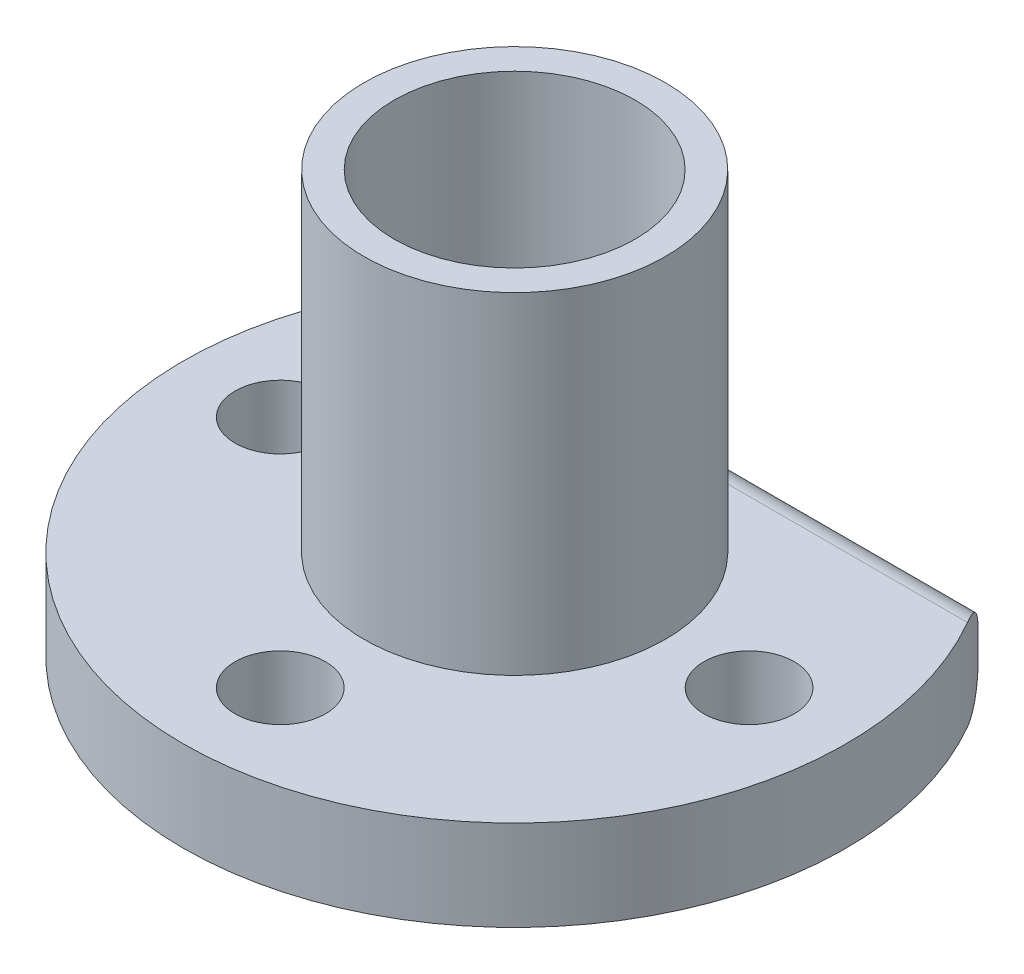
ISO-10303-21;
HEADER;
FILE_DESCRIPTION(('STEP AP214'),'2;1');
FILE_NAME('part.step','',(''),(''),'','','');
FILE_SCHEMA(('AUTOMOTIVE_DESIGN { 1 0 10303 214 1 1 1 1 }'));
ENDSEC;
DATA;
#1=APPLICATION_CONTEXT('core data for automotive mechanical design processes');
#2=APPLICATION_PROTOCOL_DEFINITION('international standard','automotive_design',2000,#1);
#3=PRODUCT_CONTEXT('',#1,'mechanical');
#4=PRODUCT('Part','Part','',(#3));
#5=PRODUCT_RELATED_PRODUCT_CATEGORY('part','',(#4));
#6=PRODUCT_DEFINITION_FORMATION('','',#4);
#7=PRODUCT_DEFINITION_CONTEXT('part definition',#1,'design');
#8=PRODUCT_DEFINITION('design','',#6,#7);
#9=PRODUCT_DEFINITION_SHAPE('','',#8);
#10=(LENGTH_UNIT() NAMED_UNIT(*) SI_UNIT(.MILLI.,.METRE.));
#11=(NAMED_UNIT(*) PLANE_ANGLE_UNIT() SI_UNIT($,.RADIAN.));
#12=(NAMED_UNIT(*) SI_UNIT($,.STERADIAN.) SOLID_ANGLE_UNIT());
#13=UNCERTAINTY_MEASURE_WITH_UNIT(LENGTH_MEASURE(1.E-05),#10,'distance_accuracy_value','');
#14=(GEOMETRIC_REPRESENTATION_CONTEXT(3) GLOBAL_UNCERTAINTY_ASSIGNED_CONTEXT((#13)) GLOBAL_UNIT_ASSIGNED_CONTEXT((#10,
#11,#12)) REPRESENTATION_CONTEXT('',''));
#15=CARTESIAN_POINT('',(0.,0.,0.));
#16=DIRECTION('',(0.,0.,1.));
#17=DIRECTION('',(1.,0.,0.));
#18=AXIS2_PLACEMENT_3D('',#15,#16,#17);
#19=CARTESIAN_POINT('',(5.,0.,0.));
#20=DIRECTION('',(0.,-1.,0.));
#21=DIRECTION('',(0.,0.,-1.));
#22=AXIS2_PLACEMENT_3D('',#19,#20,#21);
#23=PLANE('',#22);
#24=CARTESIAN_POINT('',(0.,0.,0.));
#25=DIRECTION('',(0.,-1.,0.));
#26=DIRECTION('',(0.,0.,-1.));
#27=AXIS2_PLACEMENT_3D('',#24,#25,#26);
#28=CIRCLE('',#27,5.);
#29=CARTESIAN_POINT('',(0.,0.,-5.));
#30=VERTEX_POINT('',#29);
#31=EDGE_CURVE('E137',#30,#30,#28,.T.);
#32=ORIENTED_EDGE('',*,*,#31,.T.);
#33=EDGE_LOOP('',(#32));
#34=FACE_BOUND('',#33,.T.);
#35=CARTESIAN_POINT('',(0.,0.,0.));
#36=DIRECTION('',(0.,-1.,0.));
#37=DIRECTION('',(0.,0.,-1.));
#38=AXIS2_PLACEMENT_3D('',#35,#36,#37);
#39=CIRCLE('',#38,4.);
#40=CARTESIAN_POINT('',(0.,0.,-4.));
#41=VERTEX_POINT('',#40);
#42=EDGE_CURVE('E156',#41,#41,#39,.T.);
#43=ORIENTED_EDGE('',*,*,#42,.F.);
#44=EDGE_LOOP('',(#43));
#45=FACE_BOUND('',#44,.T.);
#46=ADVANCED_FACE('F33',(#34,#45),#23,.T.);
#47=CARTESIAN_POINT('',(0.,0.,0.));
#48=DIRECTION('',(0.,-1.,0.));
#49=DIRECTION('',(0.,0.,-1.));
#50=AXIS2_PLACEMENT_3D('',#47,#48,#49);
#51=CYLINDRICAL_SURFACE('',#50,4.);
#52=ORIENTED_EDGE('',*,*,#42,.T.);
#53=EDGE_LOOP('',(#52));
#54=FACE_BOUND('',#53,.T.);
#55=CARTESIAN_POINT('',(0.,15.,0.));
#56=DIRECTION('',(0.,-1.,0.));
#57=DIRECTION('',(0.,0.,-1.));
#58=AXIS2_PLACEMENT_3D('',#55,#56,#57);
#59=CIRCLE('',#58,4.);
#60=CARTESIAN_POINT('',(0.,15.,-4.));
#61=VERTEX_POINT('',#60);
#62=EDGE_CURVE('E153',#61,#61,#59,.T.);
#63=ORIENTED_EDGE('',*,*,#62,.F.);
#64=EDGE_LOOP('',(#63));
#65=FACE_BOUND('',#64,.T.);
#66=ADVANCED_FACE('F234',(#54,#65),#51,.F.);
#67=CARTESIAN_POINT('',(4.,15.,0.));
#68=DIRECTION('',(0.,1.,0.));
#69=DIRECTION('',(0.,0.,1.));
#70=AXIS2_PLACEMENT_3D('',#67,#68,#69);
#71=PLANE('',#70);
#72=ORIENTED_EDGE('',*,*,#62,.T.);
#73=EDGE_LOOP('',(#72));
#74=FACE_BOUND('',#73,.T.);
#75=CARTESIAN_POINT('',(0.,15.,0.));
#76=DIRECTION('',(0.,-1.,0.));
#77=DIRECTION('',(0.,0.,-1.));
#78=AXIS2_PLACEMENT_3D('',#75,#76,#77);
#79=CIRCLE('',#78,5.);
#80=CARTESIAN_POINT('',(0.,15.,-5.));
#81=VERTEX_POINT('',#80);
#82=EDGE_CURVE('E150',#81,#81,#79,.T.);
#83=ORIENTED_EDGE('',*,*,#82,.F.);
#84=EDGE_LOOP('',(#83));
#85=FACE_BOUND('',#84,.T.);
#86=ADVANCED_FACE('F239',(#74,#85),#71,.T.);
#87=CARTESIAN_POINT('',(0.,0.,0.));
#88=DIRECTION('',(0.,-1.,0.));
#89=DIRECTION('',(0.,0.,-1.));
#90=AXIS2_PLACEMENT_3D('',#87,#88,#89);
#91=CYLINDRICAL_SURFACE('',#90,5.);
#92=ORIENTED_EDGE('',*,*,#82,.T.);
#93=EDGE_LOOP('',(#92));
#94=FACE_BOUND('',#93,.T.);
#95=CARTESIAN_POINT('',(0.,4.,0.));
#96=DIRECTION('',(0.,-1.,0.));
#97=DIRECTION('',(0.,0.,-1.));
#98=AXIS2_PLACEMENT_3D('',#95,#96,#97);
#99=CIRCLE('',#98,5.);
#100=CARTESIAN_POINT('',(0.,4.,-5.));
#101=VERTEX_POINT('',#100);
#102=EDGE_CURVE('E147',#101,#101,#99,.T.);
#103=ORIENTED_EDGE('',*,*,#102,.F.);
#104=EDGE_LOOP('',(#103));
#105=FACE_BOUND('',#104,.T.);
#106=ADVANCED_FACE('F249',(#94,#105),#91,.T.);
#107=CARTESIAN_POINT('',(5.,4.,0.));
#108=DIRECTION('',(0.,1.,0.));
#109=DIRECTION('',(0.,0.,1.));
#110=AXIS2_PLACEMENT_3D('',#107,#108,#109);
#111=PLANE('',#110);
#112=CARTESIAN_POINT('',(0.,4.,0.));
#113=DIRECTION('',(0.,-1.,0.));
#114=DIRECTION('',(0.,0.,-1.));
#115=AXIS2_PLACEMENT_3D('',#112,#113,#114);
#116=CIRCLE('',#115,11.);
#117=CARTESIAN_POINT('',(9.52627944162882,4.,-5.5));
#118=VERTEX_POINT('',#117);
#119=CARTESIAN_POINT('',(-9.52627944162882,4.,-5.5));
#120=VERTEX_POINT('',#119);
#121=EDGE_CURVE('E145',#118,#120,#116,.T.);
#122=ORIENTED_EDGE('',*,*,#121,.F.);
#123=DIRECTION('',(1.,0.,0.));
#124=VECTOR('',#123,1.);
#125=CARTESIAN_POINT('',(-8.87411967464942,4.,-5.5));
#126=LINE('',#125,#124);
#127=EDGE_CURVE('E11',#118,#120,#126,.F.);
#128=ORIENTED_EDGE('',*,*,#127,.T.);
#129=EDGE_LOOP('',(#122,#128));
#130=FACE_BOUND('',#129,.T.);
#131=CARTESIAN_POINT('',(-7.77817459305202,4.,0.));
#132=DIRECTION('',(0.,1.,0.));
#133=DIRECTION('',(0.,0.,1.));
#134=AXIS2_PLACEMENT_3D('',#131,#132,#133);
#135=CIRCLE('',#134,1.5);
#136=CARTESIAN_POINT('',(-7.77817459305202,4.,-1.5));
#137=VERTEX_POINT('',#136);
#138=EDGE_CURVE('E128',#137,#137,#135,.T.);
#139=ORIENTED_EDGE('',*,*,#138,.F.);
#140=EDGE_LOOP('',(#139));
#141=FACE_BOUND('',#140,.T.);
#142=CARTESIAN_POINT('',(0.,4.,7.77817459305202));
#143=DIRECTION('',(0.,1.,0.));
#144=DIRECTION('',(0.,0.,1.));
#145=AXIS2_PLACEMENT_3D('',#142,#143,#144);
#146=CIRCLE('',#145,1.5);
#147=CARTESIAN_POINT('',(0.,4.,6.27817459305202));
#148=VERTEX_POINT('',#147);
#149=EDGE_CURVE('E123',#148,#148,#146,.T.);
#150=ORIENTED_EDGE('',*,*,#149,.F.);
#151=EDGE_LOOP('',(#150));
#152=FACE_BOUND('',#151,.T.);
#153=CARTESIAN_POINT('',(7.77817459305202,4.,0.));
#154=DIRECTION('',(0.,1.,0.));
#155=DIRECTION('',(0.,0.,1.));
#156=AXIS2_PLACEMENT_3D('',#153,#154,#155);
#157=CIRCLE('',#156,1.5);
#158=CARTESIAN_POINT('',(7.77817459305202,4.,-1.5));
#159=VERTEX_POINT('',#158);
#160=EDGE_CURVE('E134',#159,#159,#157,.T.);
#161=ORIENTED_EDGE('',*,*,#160,.F.);
#162=EDGE_LOOP('',(#161));
#163=FACE_BOUND('',#162,.T.);
#164=ORIENTED_EDGE('',*,*,#102,.T.);
#165=EDGE_LOOP('',(#164));
#166=FACE_BOUND('',#165,.T.);
#167=ADVANCED_FACE('F178',(#130,#141,#152,#163,#166),#111,.T.);
#168=CARTESIAN_POINT('',(0.,0.,0.));
#169=DIRECTION('',(0.,-1.,0.));
#170=DIRECTION('',(0.,0.,-1.));
#171=AXIS2_PLACEMENT_3D('',#168,#169,#170);
#172=CYLINDRICAL_SURFACE('',#171,11.);
#173=DIRECTION('',(0.,1.,0.));
#174=VECTOR('',#173,1.);
#175=CARTESIAN_POINT('',(-8.87411967464942,0.,-6.5));
#176=LINE('',#175,#174);
#177=CARTESIAN_POINT('',(-8.87411967464942,2.,-6.5));
#178=VERTEX_POINT('',#177);
#179=CARTESIAN_POINT('',(-8.87411967464942,3.,-6.5));
#180=VERTEX_POINT('',#179);
#181=EDGE_CURVE('E105',#178,#180,#176,.T.);
#182=ORIENTED_EDGE('',*,*,#181,.F.);
#183=CARTESIAN_POINT('',(-8.87411967464942,2.,-6.5));
#184=CARTESIAN_POINT('',(-8.87411733521859,1.97552243158006,-6.50000224266943));
#185=CARTESIAN_POINT('',(-8.87477854433625,1.95105865034541,-6.49910056311208));
#186=CARTESIAN_POINT('',(-8.8774001363763,1.90234471577609,-6.49551955800258));
#187=CARTESIAN_POINT('',(-8.87935981091365,1.87809445326058,-6.4928412017254));
#188=CARTESIAN_POINT('',(-8.88710945439656,1.80623955474375,-6.48223460807233));
#189=CARTESIAN_POINT('',(-8.8947709059744,1.75918344863951,-6.47173387510639));
#190=CARTESIAN_POINT('',(-8.91452389554418,1.66805184040037,-6.44449694865473));
#191=CARTESIAN_POINT('',(-8.92660740642685,1.62397110790175,-6.42777205260846));
#192=CARTESIAN_POINT('',(-8.95448676592331,1.53949479339217,-6.38887615509148));
#193=CARTESIAN_POINT('',(-8.97028793725721,1.49910461148745,-6.36669734295916));
#194=CARTESIAN_POINT('',(-9.00618568588709,1.41963334334644,-6.31582610745991));
#195=CARTESIAN_POINT('',(-9.02652154580642,1.38090166515607,-6.28675993204139));
#196=CARTESIAN_POINT('',(-9.06974282390675,1.30880541186457,-6.22424385930395));
#197=CARTESIAN_POINT('',(-9.09262886991434,1.27544216337214,-6.19079288213803));
#198=CARTESIAN_POINT('',(-9.14463537393784,1.20857895021427,-6.11376936828728));
#199=CARTESIAN_POINT('',(-9.17412476464895,1.17620185861564,-6.06947037548908));
#200=CARTESIAN_POINT('',(-9.23465815806106,1.11940270588087,-5.97696940333824));
#201=CARTESIAN_POINT('',(-9.26570385288908,1.09498953003808,-5.92876313899113));
#202=CARTESIAN_POINT('',(-9.33510711845153,1.05002386840362,-5.81900105702275));
#203=CARTESIAN_POINT('',(-9.37363040565232,1.03136038011265,-5.75676852722461));
#204=CARTESIAN_POINT('',(-9.4504359019863,1.00635907339172,-5.62982566413355));
#205=CARTESIAN_POINT('',(-9.48871832113079,1.00000838329907,-5.56511799059213));
#206=CARTESIAN_POINT('',(-9.52627944162882,1.,-5.5));
#207=B_SPLINE_CURVE_WITH_KNOTS('',3,(#183,#184,#185,#186,#187,#188,#189,#190,#191,#192,#193,
#194,#195,#196,#197,#198,#199,#200,#201,#202,#203,#204,#205,#206),.UNSPECIFIED.,.F.,.F.,(4,2,2,
2,2,2,2,2,2,2,2,4),(0.,0.0733807615098602,0.146721522662486,0.292376076287692,0.4377675325565,
0.583368431994158,0.740356106608181,0.897382515535377,1.08353983997591,1.26990415428719,
1.49542651310196,1.72071298595469),.UNSPECIFIED.);
#208=CARTESIAN_POINT('',(-9.52627944162882,1.,-5.5));
#209=VERTEX_POINT('',#208);
#210=EDGE_CURVE('E87',#178,#209,#207,.T.);
#211=ORIENTED_EDGE('',*,*,#210,.T.);
#212=CARTESIAN_POINT('',(0.,1.,0.));
#213=DIRECTION('',(0.,-1.,0.));
#214=DIRECTION('',(0.,0.,-1.));
#215=AXIS2_PLACEMENT_3D('',#212,#213,#214);
#216=CIRCLE('',#215,11.);
#217=CARTESIAN_POINT('',(9.52627944162882,1.,-5.5));
#218=VERTEX_POINT('',#217);
#219=EDGE_CURVE('E143',#218,#209,#216,.T.);
#220=ORIENTED_EDGE('',*,*,#219,.F.);
#221=CARTESIAN_POINT('',(9.52627944162882,1.,-5.5));
#222=CARTESIAN_POINT('',(9.50497762594167,1.00000645750292,-5.53689883173628));
#223=CARTESIAN_POINT('',(9.48347545818617,1.00204311444901,-5.57364268361715));
#224=CARTESIAN_POINT('',(9.44024072133037,1.01011623979461,-5.64656078851044));
#225=CARTESIAN_POINT('',(9.41850811011904,1.01615345209341,-5.68273493430558));
#226=CARTESIAN_POINT('',(9.35307058170986,1.04023332946574,-5.7902582056198));
#227=CARTESIAN_POINT('',(9.30928682310176,1.06424338955272,-5.86033003735499));
#228=CARTESIAN_POINT('',(9.22846820970288,1.12395148276247,-5.98668277091864));
#229=CARTESIAN_POINT('',(9.19123325075071,1.15800368881251,-6.04362501119194));
#230=CARTESIAN_POINT('',(9.11988980612419,1.23779265726256,-6.15074961575707));
#231=CARTESIAN_POINT('',(9.08577224402027,1.2834939279424,-6.20095181822179));
#232=CARTESIAN_POINT('',(9.03091608643213,1.37273648685774,-6.28046641498379));
#233=CARTESIAN_POINT('',(9.00900513097411,1.4137508357753,-6.31181670074728));
#234=CARTESIAN_POINT('',(8.96904408289645,1.50152497015127,-6.36847298356024));
#235=CARTESIAN_POINT('',(8.95099404474053,1.54828483664369,-6.39377889534583));
#236=CARTESIAN_POINT('',(8.91979073577717,1.64712255934501,-6.43724021851489));
#237=CARTESIAN_POINT('',(8.90668353200379,1.69924494710103,-6.45532844768));
#238=CARTESIAN_POINT('',(8.8867652353124,1.80683617075153,-6.48272321791942));
#239=CARTESIAN_POINT('',(8.8799350224314,1.86229429226268,-6.4920564289382));
#240=CARTESIAN_POINT('',(8.87575398968204,1.93182673472634,-6.49776811979553));
#241=CARTESIAN_POINT('',(8.87514130393432,1.94544896623536,-6.49860496031371));
#242=CARTESIAN_POINT('',(8.87432488733497,1.97271192583679,-6.49971992916767));
#243=CARTESIAN_POINT('',(8.87412066015987,1.98635261130234,-6.49999873557844));
#244=CARTESIAN_POINT('',(8.87411967464944,2.,-6.5));
#245=B_SPLINE_CURVE_WITH_KNOTS('',3,(#221,#222,#223,#224,#225,#226,#227,#228,#229,#230,#231,
#232,#233,#234,#235,#236,#237,#238,#239,#240,#241,#242,#243,#244),.UNSPECIFIED.,.F.,.F.,(4,2,2,
2,2,2,2,2,2,2,2,4),(0.,0.127704562189382,0.255432877581282,0.51183830286834,0.738993142561883,
0.965464003756881,1.13306157358515,1.30066150745875,1.46978697688592,1.63839555920461,
1.67936979929296,1.72029422071364),.UNSPECIFIED.);
#246=CARTESIAN_POINT('',(8.87411967464942,2.,-6.5));
#247=VERTEX_POINT('',#246);
#248=EDGE_CURVE('E98',#218,#247,#245,.T.);
#249=ORIENTED_EDGE('',*,*,#248,.T.);
#250=DIRECTION('',(0.,1.,0.));
#251=VECTOR('',#250,1.);
#252=CARTESIAN_POINT('',(8.87411967464942,0.,-6.5));
#253=LINE('',#252,#251);
#254=CARTESIAN_POINT('',(8.87411967464942,3.,-6.5));
#255=VERTEX_POINT('',#254);
#256=EDGE_CURVE('E114',#247,#255,#253,.T.);
#257=ORIENTED_EDGE('',*,*,#256,.T.);
#258=CARTESIAN_POINT('',(8.87411967464942,3.,-6.5));
#259=CARTESIAN_POINT('',(8.87411733521859,3.02447756841994,-6.50000224266943));
#260=CARTESIAN_POINT('',(8.87477854433625,3.04894134965459,-6.49910056311208));
#261=CARTESIAN_POINT('',(8.8774001363763,3.09765528422391,-6.49551955800258));
#262=CARTESIAN_POINT('',(8.87935981091365,3.12190554673942,-6.4928412017254));
#263=CARTESIAN_POINT('',(8.88710945439656,3.19376044525625,-6.48223460807233));
#264=CARTESIAN_POINT('',(8.8947709059744,3.24081655136049,-6.47173387510639));
#265=CARTESIAN_POINT('',(8.91452389554418,3.33194815959963,-6.44449694865473));
#266=CARTESIAN_POINT('',(8.92660740642685,3.37602889209825,-6.42777205260846));
#267=CARTESIAN_POINT('',(8.95448676592331,3.46050520660783,-6.38887615509148));
#268=CARTESIAN_POINT('',(8.97028793725721,3.50089538851255,-6.36669734295916));
#269=CARTESIAN_POINT('',(9.00618568588709,3.58036665665356,-6.31582610745991));
#270=CARTESIAN_POINT('',(9.02652154580642,3.61909833484393,-6.28675993204139));
#271=CARTESIAN_POINT('',(9.06974282390675,3.69119458813543,-6.22424385930395));
#272=CARTESIAN_POINT('',(9.09262886991434,3.72455783662785,-6.19079288213803));
#273=CARTESIAN_POINT('',(9.14463537393784,3.79142104978573,-6.11376936828728));
#274=CARTESIAN_POINT('',(9.17412476464895,3.82379814138436,-6.06947037548908));
#275=CARTESIAN_POINT('',(9.23465815806106,3.88059729411913,-5.97696940333824));
#276=CARTESIAN_POINT('',(9.26570385288908,3.90501046996192,-5.92876313899113));
#277=CARTESIAN_POINT('',(9.33510711845153,3.94997613159638,-5.81900105702275));
#278=CARTESIAN_POINT('',(9.37363040565232,3.96863961988735,-5.7567685272246));
#279=CARTESIAN_POINT('',(9.4504359019863,3.99364092660828,-5.62982566413354));
#280=CARTESIAN_POINT('',(9.48871832113079,3.99999161670093,-5.56511799059213));
#281=CARTESIAN_POINT('',(9.52627944162882,4.,-5.5));
#282=B_SPLINE_CURVE_WITH_KNOTS('',3,(#258,#259,#260,#261,#262,#263,#264,#265,#266,#267,#268,
#269,#270,#271,#272,#273,#274,#275,#276,#277,#278,#279,#280,#281),.UNSPECIFIED.,.F.,.F.,(4,2,2,
2,2,2,2,2,2,2,2,4),(0.,0.0733807615098606,0.146721522662487,0.292376076287692,0.437767532556499,
0.583368431994158,0.74035610660818,0.897382515535377,1.08353983997591,1.26990415428719,
1.49542651310197,1.72071298595469),.UNSPECIFIED.);
#283=EDGE_CURVE('E168',#255,#118,#282,.T.);
#284=ORIENTED_EDGE('',*,*,#283,.T.);
#285=ORIENTED_EDGE('',*,*,#121,.T.);
#286=CARTESIAN_POINT('',(-9.52627944162882,4.,-5.5));
#287=CARTESIAN_POINT('',(-9.50497762594167,3.99999354249708,-5.53689883173628));
#288=CARTESIAN_POINT('',(-9.48347545818617,3.99795688555099,-5.57364268361715));
#289=CARTESIAN_POINT('',(-9.44024072133037,3.98988376020539,-5.64656078851044));
#290=CARTESIAN_POINT('',(-9.41850811011904,3.98384654790659,-5.68273493430558));
#291=CARTESIAN_POINT('',(-9.35307058170986,3.95976667053426,-5.7902582056198));
#292=CARTESIAN_POINT('',(-9.30928682310176,3.93575661044728,-5.86033003735499));
#293=CARTESIAN_POINT('',(-9.22846820970288,3.87604851723753,-5.98668277091864));
#294=CARTESIAN_POINT('',(-9.19123325075071,3.84199631118749,-6.04362501119194));
#295=CARTESIAN_POINT('',(-9.11988980612419,3.76220734273744,-6.15074961575707));
#296=CARTESIAN_POINT('',(-9.08577224402027,3.7165060720576,-6.20095181822179));
#297=CARTESIAN_POINT('',(-9.03091608643213,3.62726351314226,-6.28046641498379));
#298=CARTESIAN_POINT('',(-9.00900513097411,3.5862491642247,-6.31181670074728));
#299=CARTESIAN_POINT('',(-8.96904408289645,3.49847502984873,-6.36847298356024));
#300=CARTESIAN_POINT('',(-8.95099404474053,3.45171516335631,-6.39377889534583));
#301=CARTESIAN_POINT('',(-8.91979073577717,3.35287744065499,-6.43724021851489));
#302=CARTESIAN_POINT('',(-8.90668353200379,3.30075505289897,-6.45532844768));
#303=CARTESIAN_POINT('',(-8.8867652353124,3.19316382924847,-6.48272321791942));
#304=CARTESIAN_POINT('',(-8.8799350224314,3.13770570773732,-6.4920564289382));
#305=CARTESIAN_POINT('',(-8.87575398968204,3.06817326527366,-6.49776811979553));
#306=CARTESIAN_POINT('',(-8.87514130393432,3.05455103376464,-6.49860496031371));
#307=CARTESIAN_POINT('',(-8.87432488733497,3.02728807416321,-6.49971992916767));
#308=CARTESIAN_POINT('',(-8.87412066015987,3.01364738869766,-6.49999873557844));
#309=CARTESIAN_POINT('',(-8.87411967464944,3.,-6.5));
#310=B_SPLINE_CURVE_WITH_KNOTS('',3,(#286,#287,#288,#289,#290,#291,#292,#293,#294,#295,#296,
#297,#298,#299,#300,#301,#302,#303,#304,#305,#306,#307,#308,#309),.UNSPECIFIED.,.F.,.F.,(4,2,2,
2,2,2,2,2,2,2,2,4),(0.,0.127704562189382,0.255432877581282,0.51183830286834,0.738993142561883,
0.965464003756881,1.13306157358515,1.30066150745875,1.46978697688592,1.63839555920461,
1.67936979929296,1.72029422071364),.UNSPECIFIED.);
#311=EDGE_CURVE('E108',#120,#180,#310,.T.);
#312=ORIENTED_EDGE('',*,*,#311,.T.);
#313=EDGE_LOOP('',(#182,#211,#220,#249,#257,#284,#285,#312));
#314=FACE_BOUND('',#313,.T.);
#315=ADVANCED_FACE('F111',(#314),#172,.T.);
#316=CARTESIAN_POINT('',(11.,1.,0.));
#317=DIRECTION('',(0.,-1.,0.));
#318=DIRECTION('',(0.,0.,-1.));
#319=AXIS2_PLACEMENT_3D('',#316,#317,#318);
#320=PLANE('',#319);
#321=ORIENTED_EDGE('',*,*,#219,.T.);
#322=DIRECTION('',(-1.,0.,0.));
#323=VECTOR('',#322,1.);
#324=CARTESIAN_POINT('',(-0.785028476984306,1.,-5.5));
#325=LINE('',#324,#323);
#326=EDGE_CURVE('E93',#209,#218,#325,.F.);
#327=ORIENTED_EDGE('',*,*,#326,.T.);
#328=EDGE_LOOP('',(#321,#327));
#329=FACE_BOUND('',#328,.T.);
#330=CARTESIAN_POINT('',(-7.77817459305202,1.,0.));
#331=DIRECTION('',(0.,-1.,0.));
#332=DIRECTION('',(0.,0.,-1.));
#333=AXIS2_PLACEMENT_3D('',#330,#331,#332);
#334=CIRCLE('',#333,1.5);
#335=CARTESIAN_POINT('',(-7.77817459305202,0.999999999999999,-1.5));
#336=VERTEX_POINT('',#335);
#337=EDGE_CURVE('E120',#336,#336,#334,.T.);
#338=ORIENTED_EDGE('',*,*,#337,.F.);
#339=EDGE_LOOP('',(#338));
#340=FACE_BOUND('',#339,.T.);
#341=CARTESIAN_POINT('',(0.,1.,7.77817459305202));
#342=DIRECTION('',(0.,-1.,0.));
#343=DIRECTION('',(0.,0.,-1.));
#344=AXIS2_PLACEMENT_3D('',#341,#342,#343);
#345=CIRCLE('',#344,1.5);
#346=CARTESIAN_POINT('',(0.,0.999999999999999,6.27817459305202));
#347=VERTEX_POINT('',#346);
#348=EDGE_CURVE('E117',#347,#347,#345,.T.);
#349=ORIENTED_EDGE('',*,*,#348,.F.);
#350=EDGE_LOOP('',(#349));
#351=FACE_BOUND('',#350,.T.);
#352=CARTESIAN_POINT('',(7.77817459305202,1.,0.));
#353=DIRECTION('',(0.,-1.,0.));
#354=DIRECTION('',(0.,0.,-1.));
#355=AXIS2_PLACEMENT_3D('',#352,#353,#354);
#356=CIRCLE('',#355,1.5);
#357=CARTESIAN_POINT('',(7.77817459305202,0.999999999999999,-1.5));
#358=VERTEX_POINT('',#357);
#359=EDGE_CURVE('E131',#358,#358,#356,.T.);
#360=ORIENTED_EDGE('',*,*,#359,.F.);
#361=EDGE_LOOP('',(#360));
#362=FACE_BOUND('',#361,.T.);
#363=CARTESIAN_POINT('',(0.,1.,0.));
#364=DIRECTION('',(0.,-1.,0.));
#365=DIRECTION('',(0.,0.,-1.));
#366=AXIS2_PLACEMENT_3D('',#363,#364,#365);
#367=CIRCLE('',#366,5.);
#368=CARTESIAN_POINT('',(0.,1.,-5.));
#369=VERTEX_POINT('',#368);
#370=EDGE_CURVE('E140',#369,#369,#367,.T.);
#371=ORIENTED_EDGE('',*,*,#370,.F.);
#372=EDGE_LOOP('',(#371));
#373=FACE_BOUND('',#372,.T.);
#374=ADVANCED_FACE('F177',(#329,#340,#351,#362,#373),#320,.T.);
#375=CARTESIAN_POINT('',(0.,0.,0.));
#376=DIRECTION('',(0.,-1.,0.));
#377=DIRECTION('',(0.,0.,-1.));
#378=AXIS2_PLACEMENT_3D('',#375,#376,#377);
#379=CYLINDRICAL_SURFACE('',#378,5.);
#380=ORIENTED_EDGE('',*,*,#370,.T.);
#381=EDGE_LOOP('',(#380));
#382=FACE_BOUND('',#381,.T.);
#383=ORIENTED_EDGE('',*,*,#31,.F.);
#384=EDGE_LOOP('',(#383));
#385=FACE_BOUND('',#384,.T.);
#386=ADVANCED_FACE('F223',(#382,#385),#379,.T.);
#387=CARTESIAN_POINT('',(7.77817459305202,15.,0.));
#388=DIRECTION('',(0.,-1.,0.));
#389=DIRECTION('',(0.,0.,-1.));
#390=AXIS2_PLACEMENT_3D('',#387,#388,#389);
#391=CYLINDRICAL_SURFACE('',#390,1.5);
#392=CARTESIAN_POINT('',(7.77817459305202,4.,-1.5));
#393=CARTESIAN_POINT('',(7.77817459305202,3.96875,-1.5));
#394=CARTESIAN_POINT('',(7.77817459305202,3.9375,-1.5));
#395=CARTESIAN_POINT('',(7.77817459305202,3.875,-1.5));
#396=CARTESIAN_POINT('',(7.77817459305202,3.84375,-1.5));
#397=CARTESIAN_POINT('',(7.77817459305202,3.78125,-1.5));
#398=CARTESIAN_POINT('',(7.77817459305202,3.75,-1.5));
#399=CARTESIAN_POINT('',(7.77817459305202,3.6875,-1.5));
#400=CARTESIAN_POINT('',(7.77817459305202,3.65625,-1.5));
#401=CARTESIAN_POINT('',(7.77817459305202,3.59375,-1.5));
#402=CARTESIAN_POINT('',(7.77817459305202,3.5625,-1.5));
#403=CARTESIAN_POINT('',(7.77817459305202,3.5,-1.5));
#404=CARTESIAN_POINT('',(7.77817459305202,3.46875,-1.5));
#405=CARTESIAN_POINT('',(7.77817459305202,3.40625,-1.5));
#406=CARTESIAN_POINT('',(7.77817459305202,3.375,-1.5));
#407=CARTESIAN_POINT('',(7.77817459305202,3.3125,-1.5));
#408=CARTESIAN_POINT('',(7.77817459305202,3.28125,-1.5));
#409=CARTESIAN_POINT('',(7.77817459305202,3.21875,-1.5));
#410=CARTESIAN_POINT('',(7.77817459305202,3.1875,-1.5));
#411=CARTESIAN_POINT('',(7.77817459305202,3.125,-1.5));
#412=CARTESIAN_POINT('',(7.77817459305202,3.09375,-1.5));
#413=CARTESIAN_POINT('',(7.77817459305202,3.03125,-1.5));
#414=CARTESIAN_POINT('',(7.77817459305202,3.,-1.5));
#415=CARTESIAN_POINT('',(7.77817459305202,2.9375,-1.5));
#416=CARTESIAN_POINT('',(7.77817459305202,2.90625,-1.5));
#417=CARTESIAN_POINT('',(7.77817459305202,2.84375,-1.5));
#418=CARTESIAN_POINT('',(7.77817459305202,2.8125,-1.5));
#419=CARTESIAN_POINT('',(7.77817459305202,2.75,-1.5));
#420=CARTESIAN_POINT('',(7.77817459305202,2.71875,-1.5));
#421=CARTESIAN_POINT('',(7.77817459305202,2.65625,-1.5));
#422=CARTESIAN_POINT('',(7.77817459305202,2.625,-1.5));
#423=CARTESIAN_POINT('',(7.77817459305202,2.5625,-1.5));
#424=CARTESIAN_POINT('',(7.77817459305202,2.53125,-1.5));
#425=CARTESIAN_POINT('',(7.77817459305202,2.46875,-1.5));
#426=CARTESIAN_POINT('',(7.77817459305202,2.4375,-1.5));
#427=CARTESIAN_POINT('',(7.77817459305202,2.375,-1.5));
#428=CARTESIAN_POINT('',(7.77817459305202,2.34375,-1.5));
#429=CARTESIAN_POINT('',(7.77817459305202,2.28125,-1.5));
#430=CARTESIAN_POINT('',(7.77817459305202,2.25,-1.5));
#431=CARTESIAN_POINT('',(7.77817459305202,2.1875,-1.5));
#432=CARTESIAN_POINT('',(7.77817459305202,2.15625,-1.5));
#433=CARTESIAN_POINT('',(7.77817459305202,2.09375,-1.5));
#434=CARTESIAN_POINT('',(7.77817459305202,2.0625,-1.5));
#435=CARTESIAN_POINT('',(7.77817459305202,2.,-1.5));
#436=CARTESIAN_POINT('',(7.77817459305202,1.96875,-1.5));
#437=CARTESIAN_POINT('',(7.77817459305202,1.90625,-1.5));
#438=CARTESIAN_POINT('',(7.77817459305202,1.875,-1.5));
#439=CARTESIAN_POINT('',(7.77817459305202,1.8125,-1.5));
#440=CARTESIAN_POINT('',(7.77817459305202,1.78125,-1.5));
#441=CARTESIAN_POINT('',(7.77817459305202,1.71875,-1.5));
#442=CARTESIAN_POINT('',(7.77817459305202,1.6875,-1.5));
#443=CARTESIAN_POINT('',(7.77817459305202,1.625,-1.5));
#444=CARTESIAN_POINT('',(7.77817459305202,1.59375,-1.5));
#445=CARTESIAN_POINT('',(7.77817459305202,1.53125,-1.5));
#446=CARTESIAN_POINT('',(7.77817459305202,1.5,-1.5));
#447=CARTESIAN_POINT('',(7.77817459305202,1.4375,-1.5));
#448=CARTESIAN_POINT('',(7.77817459305202,1.40625,-1.5));
#449=CARTESIAN_POINT('',(7.77817459305202,1.34375,-1.5));
#450=CARTESIAN_POINT('',(7.77817459305202,1.3125,-1.5));
#451=CARTESIAN_POINT('',(7.77817459305202,1.25,-1.5));
#452=CARTESIAN_POINT('',(7.77817459305202,1.21875,-1.5));
#453=CARTESIAN_POINT('',(7.77817459305202,1.15625,-1.5));
#454=CARTESIAN_POINT('',(7.77817459305202,1.125,-1.5));
#455=CARTESIAN_POINT('',(7.77817459305202,1.0625,-1.5));
#456=CARTESIAN_POINT('',(7.77817459305202,1.03125,-1.5));
#457=CARTESIAN_POINT('',(7.77817459305202,0.999999999999999,-1.5));
#458=B_SPLINE_CURVE_WITH_KNOTS('',3,(#392,#393,#394,#395,#396,#397,#398,#399,#400,#401,#402,
#403,#404,#405,#406,#407,#408,#409,#410,#411,#412,#413,#414,#415,#416,#417,#418,#419,#420,#421,
#422,#423,#424,#425,#426,#427,#428,#429,#430,#431,#432,#433,#434,#435,#436,#437,#438,#439,#440,
#441,#442,#443,#444,#445,#446,#447,#448,#449,#450,#451,#452,#453,#454,#455,#456,#457),
.UNSPECIFIED.,.F.,.F.,(4,2,2,2,2,2,2,2,2,2,2,2,2,2,2,2,2,2,2,2,2,2,2,2,2,2,2,2,2,2,2,2,4),(0.,
0.0937500000000001,0.1875,0.28125,0.375,0.46875,0.5625,0.656250000000001,0.750000000000001,
0.843749999999999,0.937499999999999,1.03125,1.125,1.21875,1.3125,1.40625,1.5,1.59375,1.6875,
1.78125,1.875,1.96875,2.0625,2.15625,2.25,2.34375,2.4375,2.53125,2.625,2.71875,2.8125,2.90625,
3.),.UNSPECIFIED.);
#459=EDGE_CURVE('BSEAM220',#159,#358,#458,.T.);
#460=ORIENTED_EDGE('',*,*,#160,.T.);
#461=ORIENTED_EDGE('',*,*,#359,.T.);
#462=ORIENTED_EDGE('',*,*,#459,.T.);
#463=ORIENTED_EDGE('',*,*,#459,.F.);
#464=EDGE_LOOP('',(#460,#462,#461,#463));
#465=FACE_BOUND('',#464,.T.);
#466=ADVANCED_FACE('F220',(#465),#391,.F.);
#467=CARTESIAN_POINT('',(0.,15.,7.77817459305202));
#468=DIRECTION('',(0.,-1.,0.));
#469=DIRECTION('',(0.,0.,-1.));
#470=AXIS2_PLACEMENT_3D('',#467,#468,#469);
#471=CYLINDRICAL_SURFACE('',#470,1.5);
#472=CARTESIAN_POINT('',(0.,4.,6.27817459305202));
#473=CARTESIAN_POINT('',(0.,3.96875,6.27817459305202));
#474=CARTESIAN_POINT('',(0.,3.9375,6.27817459305202));
#475=CARTESIAN_POINT('',(0.,3.875,6.27817459305202));
#476=CARTESIAN_POINT('',(0.,3.84375,6.27817459305202));
#477=CARTESIAN_POINT('',(0.,3.78125,6.27817459305202));
#478=CARTESIAN_POINT('',(0.,3.75,6.27817459305202));
#479=CARTESIAN_POINT('',(0.,3.6875,6.27817459305202));
#480=CARTESIAN_POINT('',(0.,3.65625,6.27817459305202));
#481=CARTESIAN_POINT('',(0.,3.59375,6.27817459305202));
#482=CARTESIAN_POINT('',(0.,3.5625,6.27817459305202));
#483=CARTESIAN_POINT('',(0.,3.5,6.27817459305202));
#484=CARTESIAN_POINT('',(0.,3.46875,6.27817459305202));
#485=CARTESIAN_POINT('',(0.,3.40625,6.27817459305202));
#486=CARTESIAN_POINT('',(0.,3.375,6.27817459305202));
#487=CARTESIAN_POINT('',(0.,3.3125,6.27817459305202));
#488=CARTESIAN_POINT('',(0.,3.28125,6.27817459305202));
#489=CARTESIAN_POINT('',(0.,3.21875,6.27817459305202));
#490=CARTESIAN_POINT('',(0.,3.1875,6.27817459305202));
#491=CARTESIAN_POINT('',(0.,3.125,6.27817459305202));
#492=CARTESIAN_POINT('',(0.,3.09375,6.27817459305202));
#493=CARTESIAN_POINT('',(0.,3.03125,6.27817459305202));
#494=CARTESIAN_POINT('',(0.,3.,6.27817459305202));
#495=CARTESIAN_POINT('',(0.,2.9375,6.27817459305202));
#496=CARTESIAN_POINT('',(0.,2.90625,6.27817459305202));
#497=CARTESIAN_POINT('',(0.,2.84375,6.27817459305202));
#498=CARTESIAN_POINT('',(0.,2.8125,6.27817459305202));
#499=CARTESIAN_POINT('',(0.,2.75,6.27817459305202));
#500=CARTESIAN_POINT('',(0.,2.71875,6.27817459305202));
#501=CARTESIAN_POINT('',(0.,2.65625,6.27817459305202));
#502=CARTESIAN_POINT('',(0.,2.625,6.27817459305202));
#503=CARTESIAN_POINT('',(0.,2.5625,6.27817459305202));
#504=CARTESIAN_POINT('',(0.,2.53125,6.27817459305202));
#505=CARTESIAN_POINT('',(0.,2.46875,6.27817459305202));
#506=CARTESIAN_POINT('',(0.,2.4375,6.27817459305202));
#507=CARTESIAN_POINT('',(0.,2.375,6.27817459305202));
#508=CARTESIAN_POINT('',(0.,2.34375,6.27817459305202));
#509=CARTESIAN_POINT('',(0.,2.28125,6.27817459305202));
#510=CARTESIAN_POINT('',(0.,2.25,6.27817459305202));
#511=CARTESIAN_POINT('',(0.,2.1875,6.27817459305202));
#512=CARTESIAN_POINT('',(0.,2.15625,6.27817459305202));
#513=CARTESIAN_POINT('',(0.,2.09375,6.27817459305202));
#514=CARTESIAN_POINT('',(0.,2.0625,6.27817459305202));
#515=CARTESIAN_POINT('',(0.,2.,6.27817459305202));
#516=CARTESIAN_POINT('',(0.,1.96875,6.27817459305202));
#517=CARTESIAN_POINT('',(0.,1.90625,6.27817459305202));
#518=CARTESIAN_POINT('',(0.,1.875,6.27817459305202));
#519=CARTESIAN_POINT('',(0.,1.8125,6.27817459305202));
#520=CARTESIAN_POINT('',(0.,1.78125,6.27817459305202));
#521=CARTESIAN_POINT('',(0.,1.71875,6.27817459305202));
#522=CARTESIAN_POINT('',(0.,1.6875,6.27817459305202));
#523=CARTESIAN_POINT('',(0.,1.625,6.27817459305202));
#524=CARTESIAN_POINT('',(0.,1.59375,6.27817459305202));
#525=CARTESIAN_POINT('',(0.,1.53125,6.27817459305202));
#526=CARTESIAN_POINT('',(0.,1.5,6.27817459305202));
#527=CARTESIAN_POINT('',(0.,1.4375,6.27817459305202));
#528=CARTESIAN_POINT('',(0.,1.40625,6.27817459305202));
#529=CARTESIAN_POINT('',(0.,1.34375,6.27817459305202));
#530=CARTESIAN_POINT('',(0.,1.3125,6.27817459305202));
#531=CARTESIAN_POINT('',(0.,1.25,6.27817459305202));
#532=CARTESIAN_POINT('',(0.,1.21875,6.27817459305202));
#533=CARTESIAN_POINT('',(0.,1.15625,6.27817459305202));
#534=CARTESIAN_POINT('',(0.,1.125,6.27817459305202));
#535=CARTESIAN_POINT('',(0.,1.0625,6.27817459305202));
#536=CARTESIAN_POINT('',(0.,1.03125,6.27817459305202));
#537=CARTESIAN_POINT('',(0.,0.999999999999999,6.27817459305202));
#538=B_SPLINE_CURVE_WITH_KNOTS('',3,(#472,#473,#474,#475,#476,#477,#478,#479,#480,#481,#482,
#483,#484,#485,#486,#487,#488,#489,#490,#491,#492,#493,#494,#495,#496,#497,#498,#499,#500,#501,
#502,#503,#504,#505,#506,#507,#508,#509,#510,#511,#512,#513,#514,#515,#516,#517,#518,#519,#520,
#521,#522,#523,#524,#525,#526,#527,#528,#529,#530,#531,#532,#533,#534,#535,#536,#537),
.UNSPECIFIED.,.F.,.F.,(4,2,2,2,2,2,2,2,2,2,2,2,2,2,2,2,2,2,2,2,2,2,2,2,2,2,2,2,2,2,2,2,4),(0.,
0.0937500000000001,0.1875,0.28125,0.375,0.46875,0.5625,0.656250000000001,0.750000000000001,
0.843749999999999,0.937499999999999,1.03125,1.125,1.21875,1.3125,1.40625,1.5,1.59375,1.6875,
1.78125,1.875,1.96875,2.0625,2.15625,2.25,2.34375,2.4375,2.53125,2.625,2.71875,2.8125,2.90625,
3.),.UNSPECIFIED.);
#539=EDGE_CURVE('BSEAM216',#148,#347,#538,.T.);
#540=ORIENTED_EDGE('',*,*,#149,.T.);
#541=ORIENTED_EDGE('',*,*,#348,.T.);
#542=ORIENTED_EDGE('',*,*,#539,.T.);
#543=ORIENTED_EDGE('',*,*,#539,.F.);
#544=EDGE_LOOP('',(#540,#542,#541,#543));
#545=FACE_BOUND('',#544,.T.);
#546=ADVANCED_FACE('F216',(#545),#471,.F.);
#547=CARTESIAN_POINT('',(-7.77817459305202,15.,0.));
#548=DIRECTION('',(0.,-1.,0.));
#549=DIRECTION('',(0.,0.,-1.));
#550=AXIS2_PLACEMENT_3D('',#547,#548,#549);
#551=CYLINDRICAL_SURFACE('',#550,1.5);
#552=CARTESIAN_POINT('',(-7.77817459305202,4.,-1.5));
#553=CARTESIAN_POINT('',(-7.77817459305202,3.96875,-1.5));
#554=CARTESIAN_POINT('',(-7.77817459305202,3.9375,-1.5));
#555=CARTESIAN_POINT('',(-7.77817459305202,3.875,-1.5));
#556=CARTESIAN_POINT('',(-7.77817459305202,3.84375,-1.5));
#557=CARTESIAN_POINT('',(-7.77817459305202,3.78125,-1.5));
#558=CARTESIAN_POINT('',(-7.77817459305202,3.75,-1.5));
#559=CARTESIAN_POINT('',(-7.77817459305202,3.6875,-1.5));
#560=CARTESIAN_POINT('',(-7.77817459305202,3.65625,-1.5));
#561=CARTESIAN_POINT('',(-7.77817459305202,3.59375,-1.5));
#562=CARTESIAN_POINT('',(-7.77817459305202,3.5625,-1.5));
#563=CARTESIAN_POINT('',(-7.77817459305202,3.5,-1.5));
#564=CARTESIAN_POINT('',(-7.77817459305202,3.46875,-1.5));
#565=CARTESIAN_POINT('',(-7.77817459305202,3.40625,-1.5));
#566=CARTESIAN_POINT('',(-7.77817459305202,3.375,-1.5));
#567=CARTESIAN_POINT('',(-7.77817459305202,3.3125,-1.5));
#568=CARTESIAN_POINT('',(-7.77817459305202,3.28125,-1.5));
#569=CARTESIAN_POINT('',(-7.77817459305202,3.21875,-1.5));
#570=CARTESIAN_POINT('',(-7.77817459305202,3.1875,-1.5));
#571=CARTESIAN_POINT('',(-7.77817459305202,3.125,-1.5));
#572=CARTESIAN_POINT('',(-7.77817459305202,3.09375,-1.5));
#573=CARTESIAN_POINT('',(-7.77817459305202,3.03125,-1.5));
#574=CARTESIAN_POINT('',(-7.77817459305202,3.,-1.5));
#575=CARTESIAN_POINT('',(-7.77817459305202,2.9375,-1.5));
#576=CARTESIAN_POINT('',(-7.77817459305202,2.90625,-1.5));
#577=CARTESIAN_POINT('',(-7.77817459305202,2.84375,-1.5));
#578=CARTESIAN_POINT('',(-7.77817459305202,2.8125,-1.5));
#579=CARTESIAN_POINT('',(-7.77817459305202,2.75,-1.5));
#580=CARTESIAN_POINT('',(-7.77817459305202,2.71875,-1.5));
#581=CARTESIAN_POINT('',(-7.77817459305202,2.65625,-1.5));
#582=CARTESIAN_POINT('',(-7.77817459305202,2.625,-1.5));
#583=CARTESIAN_POINT('',(-7.77817459305202,2.5625,-1.5));
#584=CARTESIAN_POINT('',(-7.77817459305202,2.53125,-1.5));
#585=CARTESIAN_POINT('',(-7.77817459305202,2.46875,-1.5));
#586=CARTESIAN_POINT('',(-7.77817459305202,2.4375,-1.5));
#587=CARTESIAN_POINT('',(-7.77817459305202,2.375,-1.5));
#588=CARTESIAN_POINT('',(-7.77817459305202,2.34375,-1.5));
#589=CARTESIAN_POINT('',(-7.77817459305202,2.28125,-1.5));
#590=CARTESIAN_POINT('',(-7.77817459305202,2.25,-1.5));
#591=CARTESIAN_POINT('',(-7.77817459305202,2.1875,-1.5));
#592=CARTESIAN_POINT('',(-7.77817459305202,2.15625,-1.5));
#593=CARTESIAN_POINT('',(-7.77817459305202,2.09375,-1.5));
#594=CARTESIAN_POINT('',(-7.77817459305202,2.0625,-1.5));
#595=CARTESIAN_POINT('',(-7.77817459305202,2.,-1.5));
#596=CARTESIAN_POINT('',(-7.77817459305202,1.96875,-1.5));
#597=CARTESIAN_POINT('',(-7.77817459305202,1.90625,-1.5));
#598=CARTESIAN_POINT('',(-7.77817459305202,1.875,-1.5));
#599=CARTESIAN_POINT('',(-7.77817459305202,1.8125,-1.5));
#600=CARTESIAN_POINT('',(-7.77817459305202,1.78125,-1.5));
#601=CARTESIAN_POINT('',(-7.77817459305202,1.71875,-1.5));
#602=CARTESIAN_POINT('',(-7.77817459305202,1.6875,-1.5));
#603=CARTESIAN_POINT('',(-7.77817459305202,1.625,-1.5));
#604=CARTESIAN_POINT('',(-7.77817459305202,1.59375,-1.5));
#605=CARTESIAN_POINT('',(-7.77817459305202,1.53125,-1.5));
#606=CARTESIAN_POINT('',(-7.77817459305202,1.5,-1.5));
#607=CARTESIAN_POINT('',(-7.77817459305202,1.4375,-1.5));
#608=CARTESIAN_POINT('',(-7.77817459305202,1.40625,-1.5));
#609=CARTESIAN_POINT('',(-7.77817459305202,1.34375,-1.5));
#610=CARTESIAN_POINT('',(-7.77817459305202,1.3125,-1.5));
#611=CARTESIAN_POINT('',(-7.77817459305202,1.25,-1.5));
#612=CARTESIAN_POINT('',(-7.77817459305202,1.21875,-1.5));
#613=CARTESIAN_POINT('',(-7.77817459305202,1.15625,-1.5));
#614=CARTESIAN_POINT('',(-7.77817459305202,1.125,-1.5));
#615=CARTESIAN_POINT('',(-7.77817459305202,1.0625,-1.5));
#616=CARTESIAN_POINT('',(-7.77817459305202,1.03125,-1.5));
#617=CARTESIAN_POINT('',(-7.77817459305202,0.999999999999999,-1.5));
#618=B_SPLINE_CURVE_WITH_KNOTS('',3,(#552,#553,#554,#555,#556,#557,#558,#559,#560,#561,#562,
#563,#564,#565,#566,#567,#568,#569,#570,#571,#572,#573,#574,#575,#576,#577,#578,#579,#580,#581,
#582,#583,#584,#585,#586,#587,#588,#589,#590,#591,#592,#593,#594,#595,#596,#597,#598,#599,#600,
#601,#602,#603,#604,#605,#606,#607,#608,#609,#610,#611,#612,#613,#614,#615,#616,#617),
.UNSPECIFIED.,.F.,.F.,(4,2,2,2,2,2,2,2,2,2,2,2,2,2,2,2,2,2,2,2,2,2,2,2,2,2,2,2,2,2,2,2,4),(0.,
0.0937500000000001,0.1875,0.28125,0.375,0.46875,0.5625,0.656250000000001,0.750000000000001,
0.843749999999999,0.937499999999999,1.03125,1.125,1.21875,1.3125,1.40625,1.5,1.59375,1.6875,
1.78125,1.875,1.96875,2.0625,2.15625,2.25,2.34375,2.4375,2.53125,2.625,2.71875,2.8125,2.90625,
3.),.UNSPECIFIED.);
#619=EDGE_CURVE('BSEAM212',#137,#336,#618,.T.);
#620=ORIENTED_EDGE('',*,*,#138,.T.);
#621=ORIENTED_EDGE('',*,*,#337,.T.);
#622=ORIENTED_EDGE('',*,*,#619,.T.);
#623=ORIENTED_EDGE('',*,*,#619,.F.);
#624=EDGE_LOOP('',(#620,#622,#621,#623));
#625=FACE_BOUND('',#624,.T.);
#626=ADVANCED_FACE('F212',(#625),#551,.F.);
#627=CARTESIAN_POINT('',(0.,15.,-7.77817459305202));
#628=DIRECTION('',(0.,-1.,0.));
#629=DIRECTION('',(0.,0.,-1.));
#630=AXIS2_PLACEMENT_3D('',#627,#628,#629);
#631=CYLINDRICAL_SURFACE('',#630,1.5);
#632=DIRECTION('',(0.,-1.,0.));
#633=VECTOR('',#632,1.);
#634=CARTESIAN_POINT('',(0.785028476984306,15.,-6.5));
#635=LINE('',#634,#633);
#636=CARTESIAN_POINT('',(0.785028476984306,3.,-6.5));
#637=VERTEX_POINT('',#636);
#638=CARTESIAN_POINT('',(0.785028476984306,2.,-6.5));
#639=VERTEX_POINT('',#638);
#640=EDGE_CURVE('E159',#637,#639,#635,.T.);
#641=ORIENTED_EDGE('',*,*,#640,.T.);
#642=CARTESIAN_POINT('',(0.785028476984306,2.,-6.5));
#643=CARTESIAN_POINT('',(0.785028127654502,1.98365587398663,-6.50000205179008));
#644=CARTESIAN_POINT('',(0.784375595317902,1.9673213256405,-6.49959879347795));
#645=CARTESIAN_POINT('',(0.781772699200099,1.93479974652895,-6.49800469967001));
#646=CARTESIAN_POINT('',(0.779822740802783,1.91861267128613,-6.49681411017842));
#647=CARTESIAN_POINT('',(0.772065605308495,1.87063340256955,-6.49211349515082));
#648=CARTESIAN_POINT('',(0.764350934643436,1.83923342649201,-6.48747407249667));
#649=CARTESIAN_POINT('',(0.744060873540548,1.77860036884524,-6.47567365229052));
#650=CARTESIAN_POINT('',(0.731487536050876,1.74936637828421,-6.46851371985123));
#651=CARTESIAN_POINT('',(0.701868822849105,1.69379593053398,-6.4524057959798));
#652=CARTESIAN_POINT('',(0.684821299506985,1.66746087348648,-6.44345694635204));
#653=CARTESIAN_POINT('',(0.647224691037263,1.61875562835631,-6.42483462073766));
#654=CARTESIAN_POINT('',(0.626761936632437,1.59631027164398,-6.41518169302076));
#655=CARTESIAN_POINT('',(0.582666608244828,1.55486491113535,-6.39575630429127));
#656=CARTESIAN_POINT('',(0.559033132735528,1.53586589085785,-6.38598381000334));
#657=CARTESIAN_POINT('',(0.505643566309853,1.49882697372857,-6.36564125965793));
#658=CARTESIAN_POINT('',(0.475494805594746,1.48130845885725,-6.35515565335918));
#659=CARTESIAN_POINT('',(0.412674502113567,1.45048397413285,-6.3356821849224));
#660=CARTESIAN_POINT('',(0.380001392760936,1.43718064673189,-6.32669526395814));
#661=CARTESIAN_POINT('',(0.306629872221991,1.41234610170133,-6.30928109337555));
#662=CARTESIAN_POINT('',(0.265567024270202,1.40160132699449,-6.30126687349));
#663=CARTESIAN_POINT('',(0.181946740535598,1.38506850078109,-6.28864818436002));
#664=CARTESIAN_POINT('',(0.139388306874041,1.37928382670298,-6.28404603875109));
#665=CARTESIAN_POINT('',(0.0467119554925817,1.37180250857279,-6.27807306482044));
#666=CARTESIAN_POINT('',(-0.00351548824557584,1.37091821923884,-6.27734512697106));
#667=CARTESIAN_POINT('',(-0.103561134928125,1.37535788573941,-6.28091556774176));
#668=CARTESIAN_POINT('',(-0.153378895139748,1.38068784613925,-6.28521880778633));
#669=CARTESIAN_POINT('',(-0.253758936546367,1.39840390219998,-6.29888461299424));
#670=CARTESIAN_POINT('',(-0.304227524807205,1.41113911387112,-6.30849622183395));
#671=CARTESIAN_POINT('',(-0.401269699668129,1.44482659154306,-6.33198710256454));
#672=CARTESIAN_POINT('',(-0.447850966435236,1.46576216636588,-6.34585769332588));
#673=CARTESIAN_POINT('',(-0.521758646017954,1.50911994031707,-6.37147074600462));
#674=CARTESIAN_POINT('',(-0.550669354788644,1.5292121989186,-6.38260340297681));
#675=CARTESIAN_POINT('',(-0.604550882024774,1.57403831667372,-6.40508794733101));
#676=CARTESIAN_POINT('',(-0.629525053903835,1.59876818542922,-6.41643963876884));
#677=CARTESIAN_POINT('',(-0.674797188181791,1.65291716587431,-6.43829085228936));
#678=CARTESIAN_POINT('',(-0.695057190366047,1.68237132050728,-6.44878304365038));
#679=CARTESIAN_POINT('',(-0.729799699383759,1.74514416301261,-6.4675315143826));
#680=CARTESIAN_POINT('',(-0.744287514971432,1.77845926334336,-6.475789846008));
#681=CARTESIAN_POINT('',(-0.765297299094552,1.84286153164334,-6.48803995838917));
#682=CARTESIAN_POINT('',(-0.772660440241669,1.87358923443139,-6.49247214286706));
#683=CARTESIAN_POINT('',(-0.780062342617374,1.92050002209405,-6.49696023115214));
#684=CARTESIAN_POINT('',(-0.781922559496565,1.93631478685576,-6.49809634338574));
#685=CARTESIAN_POINT('',(-0.784405900251923,1.96808361317904,-6.49961743358364));
#686=CARTESIAN_POINT('',(-0.785028504668621,1.98403773040998,-6.50000209614299));
#687=CARTESIAN_POINT('',(-0.785028476984369,1.99999999999998,-6.50000000000001));
#688=B_SPLINE_CURVE_WITH_KNOTS('',3,(#642,#643,#644,#645,#646,#647,#648,#649,#650,#651,#652,
#653,#654,#655,#656,#657,#658,#659,#660,#661,#662,#663,#664,#665,#666,#667,#668,#669,#670,#671,
#672,#673,#674,#675,#676,#677,#678,#679,#680,#681,#682,#683,#684,#685,#686,#687),.UNSPECIFIED.,
.F.,.F.,(4,2,2,2,2,2,2,2,2,2,2,2,2,2,2,2,2,2,2,2,2,2,4),(0.,0.0489956734163216,
0.0979760452013658,0.195376392543269,0.292735629923536,0.390141685933614,0.485380882857999,
0.580647216621363,0.689472673630947,0.798366217696618,0.927458633277178,1.05663888073411,
1.20670907059996,1.35692438716824,1.51487259379522,1.67250096637067,1.78284361558398,
1.89309175330477,2.00419909418949,2.11520401101925,2.21038399584701,2.25821806065383,
2.30607219847734),.UNSPECIFIED.);
#689=CARTESIAN_POINT('',(-0.785028476984306,2.,-6.5));
#690=VERTEX_POINT('',#689);
#691=EDGE_CURVE('E42',#639,#690,#688,.T.);
#692=ORIENTED_EDGE('',*,*,#691,.T.);
#693=DIRECTION('',(0.,-1.,0.));
#694=VECTOR('',#693,1.);
#695=CARTESIAN_POINT('',(-0.785028476984306,15.,-6.5));
#696=LINE('',#695,#694);
#697=CARTESIAN_POINT('',(-0.785028476984306,3.,-6.5));
#698=VERTEX_POINT('',#697);
#699=EDGE_CURVE('E107',#690,#698,#696,.F.);
#700=ORIENTED_EDGE('',*,*,#699,.T.);
#701=CARTESIAN_POINT('',(-0.785028476984306,3.,-6.5));
#702=CARTESIAN_POINT('',(-0.785028127654503,3.01634412601337,-6.50000205179008));
#703=CARTESIAN_POINT('',(-0.784375595317903,3.0326786743595,-6.49959879347795));
#704=CARTESIAN_POINT('',(-0.781772699200099,3.06520025347105,-6.49800469967001));
#705=CARTESIAN_POINT('',(-0.779822740802783,3.08138732871387,-6.49681411017842));
#706=CARTESIAN_POINT('',(-0.772065605308495,3.12936659743045,-6.49211349515082));
#707=CARTESIAN_POINT('',(-0.764350934643436,3.16076657350799,-6.48747407249667));
#708=CARTESIAN_POINT('',(-0.744060873540549,3.22139963115476,-6.47567365229052));
#709=CARTESIAN_POINT('',(-0.731487536050877,3.25063362171579,-6.46851371985123));
#710=CARTESIAN_POINT('',(-0.701868822849106,3.30620406946602,-6.4524057959798));
#711=CARTESIAN_POINT('',(-0.684821299506986,3.33253912651352,-6.44345694635205));
#712=CARTESIAN_POINT('',(-0.647224691037264,3.38124437164368,-6.42483462073766));
#713=CARTESIAN_POINT('',(-0.626761936632439,3.40368972835602,-6.41518169302076));
#714=CARTESIAN_POINT('',(-0.58266660824483,3.44513508886465,-6.39575630429127));
#715=CARTESIAN_POINT('',(-0.55903313273553,3.46413410914215,-6.38598381000334));
#716=CARTESIAN_POINT('',(-0.505643566309856,3.50117302627143,-6.36564125965793));
#717=CARTESIAN_POINT('',(-0.475494805594749,3.51869154114275,-6.35515565335918));
#718=CARTESIAN_POINT('',(-0.412674502113571,3.54951602586715,-6.3356821849224));
#719=CARTESIAN_POINT('',(-0.38000139276094,3.56281935326811,-6.32669526395814));
#720=CARTESIAN_POINT('',(-0.306629872221996,3.58765389829866,-6.30928109337555));
#721=CARTESIAN_POINT('',(-0.265567024270207,3.59839867300551,-6.30126687349));
#722=CARTESIAN_POINT('',(-0.181946740535605,3.61493149921891,-6.28864818436002));
#723=CARTESIAN_POINT('',(-0.139388306874048,3.62071617329702,-6.28404603875109));
#724=CARTESIAN_POINT('',(-0.0467119554925894,3.62819749142721,-6.27807306482044));
#725=CARTESIAN_POINT('',(0.00351548824556764,3.62908178076116,-6.27734512697106));
#726=CARTESIAN_POINT('',(0.103561134928116,3.62464211426059,-6.28091556774176));
#727=CARTESIAN_POINT('',(0.153378895139738,3.61931215386075,-6.28521880778633));
#728=CARTESIAN_POINT('',(0.253758936546358,3.60159609780002,-6.29888461299424));
#729=CARTESIAN_POINT('',(0.304227524807195,3.58886088612888,-6.30849622183395));
#730=CARTESIAN_POINT('',(0.401269699668119,3.55517340845694,-6.33198710256453));
#731=CARTESIAN_POINT('',(0.447850966435226,3.53423783363413,-6.34585769332587));
#732=CARTESIAN_POINT('',(0.521758646017945,3.49088005968293,-6.37147074600462));
#733=CARTESIAN_POINT('',(0.550669354788635,3.47078780108141,-6.3826034029768));
#734=CARTESIAN_POINT('',(0.604550882024766,3.42596168332629,-6.405087947331));
#735=CARTESIAN_POINT('',(0.629525053903827,3.40123181457079,-6.41643963876884));
#736=CARTESIAN_POINT('',(0.674797188181784,3.3470828341257,-6.43829085228936));
#737=CARTESIAN_POINT('',(0.69505719036604,3.31762867949273,-6.44878304365038));
#738=CARTESIAN_POINT('',(0.729799699383754,3.2548558369874,-6.4675315143826));
#739=CARTESIAN_POINT('',(0.744287514971428,3.22154073665665,-6.47578984600799));
#740=CARTESIAN_POINT('',(0.765297299094549,3.15713846835667,-6.48803995838917));
#741=CARTESIAN_POINT('',(0.772660440241667,3.12641076556862,-6.49247214286706));
#742=CARTESIAN_POINT('',(0.780062342617373,3.07949997790595,-6.49696023115214));
#743=CARTESIAN_POINT('',(0.781922559496565,3.06368521314424,-6.49809634338574));
#744=CARTESIAN_POINT('',(0.784405900251923,3.03191638682096,-6.49961743358364));
#745=CARTESIAN_POINT('',(0.785028504668621,3.01596226959002,-6.50000209614299));
#746=CARTESIAN_POINT('',(0.785028476984368,3.00000000000002,-6.50000000000001));
#747=B_SPLINE_CURVE_WITH_KNOTS('',3,(#701,#702,#703,#704,#705,#706,#707,#708,#709,#710,#711,
#712,#713,#714,#715,#716,#717,#718,#719,#720,#721,#722,#723,#724,#725,#726,#727,#728,#729,#730,
#731,#732,#733,#734,#735,#736,#737,#738,#739,#740,#741,#742,#743,#744,#745,#746),.UNSPECIFIED.,
.F.,.F.,(4,2,2,2,2,2,2,2,2,2,2,2,2,2,2,2,2,2,2,2,2,2,4),(0.,0.0489956734163212,
0.0979760452013652,0.195376392543268,0.292735629923534,0.390141685933612,0.485380882857997,
0.58064721662136,0.689472673630943,0.798366217696613,0.927458633277172,1.0566388807341,
1.20670907059995,1.35692438716823,1.51487259379521,1.67250096637066,1.78284361558397,
1.89309175330475,2.00419909418948,2.11520401101924,2.21038399584701,2.25821806065383,
2.30607219847734),.UNSPECIFIED.);
#748=EDGE_CURVE('E56',#698,#637,#747,.T.);
#749=ORIENTED_EDGE('',*,*,#748,.T.);
#750=EDGE_LOOP('',(#641,#692,#700,#749));
#751=FACE_BOUND('',#750,.T.);
#752=ADVANCED_FACE('F206',(#751),#631,.F.);
#753=CARTESIAN_POINT('',(8.87411967464942,0.,-6.5));
#754=DIRECTION('',(0.,0.,1.));
#755=DIRECTION('',(1.,0.,0.));
#756=AXIS2_PLACEMENT_3D('',#753,#754,#755);
#757=PLANE('',#756);
#758=ORIENTED_EDGE('',*,*,#256,.F.);
#759=DIRECTION('',(1.,0.,0.));
#760=VECTOR('',#759,1.);
#761=CARTESIAN_POINT('',(4.82957407581686,2.,-6.5));
#762=LINE('',#761,#760);
#763=EDGE_CURVE('E49',#247,#639,#762,.F.);
#764=ORIENTED_EDGE('',*,*,#763,.T.);
#765=ORIENTED_EDGE('',*,*,#640,.F.);
#766=DIRECTION('',(-1.,0.,0.));
#767=VECTOR('',#766,1.);
#768=CARTESIAN_POINT('',(4.82957407581686,3.,-6.5));
#769=LINE('',#768,#767);
#770=EDGE_CURVE('E284',#637,#255,#769,.F.);
#771=ORIENTED_EDGE('',*,*,#770,.T.);
#772=EDGE_LOOP('',(#758,#764,#765,#771));
#773=FACE_BOUND('',#772,.T.);
#774=ADVANCED_FACE('F211',(#773),#757,.F.);
#775=ORIENTED_EDGE('',*,*,#699,.F.);
#776=DIRECTION('',(-1.,0.,0.));
#777=VECTOR('',#776,1.);
#778=CARTESIAN_POINT('',(-8.87411967464942,2.,-6.5));
#779=LINE('',#778,#777);
#780=EDGE_CURVE('E92',#690,#178,#779,.T.);
#781=ORIENTED_EDGE('',*,*,#780,.T.);
#782=ORIENTED_EDGE('',*,*,#181,.T.);
#783=DIRECTION('',(1.,0.,0.));
#784=VECTOR('',#783,1.);
#785=CARTESIAN_POINT('',(-0.785028476984306,3.,-6.5));
#786=LINE('',#785,#784);
#787=EDGE_CURVE('E109',#180,#698,#786,.T.);
#788=ORIENTED_EDGE('',*,*,#787,.T.);
#789=EDGE_LOOP('',(#775,#781,#782,#788));
#790=FACE_BOUND('',#789,.T.);
#791=ADVANCED_FACE('F103',(#790),#757,.F.);
#792=CARTESIAN_POINT('',(8.87411967464942,2.,-5.5));
#793=DIRECTION('',(1.,0.,0.));
#794=DIRECTION('',(0.,0.,-1.));
#795=AXIS2_PLACEMENT_3D('',#792,#793,#794);
#796=CYLINDRICAL_SURFACE('',#795,1.);
#797=ORIENTED_EDGE('',*,*,#248,.F.);
#798=ORIENTED_EDGE('',*,*,#326,.F.);
#799=ORIENTED_EDGE('',*,*,#210,.F.);
#800=ORIENTED_EDGE('',*,*,#780,.F.);
#801=ORIENTED_EDGE('',*,*,#691,.F.);
#802=ORIENTED_EDGE('',*,*,#763,.F.);
#803=EDGE_LOOP('',(#797,#798,#799,#800,#801,#802));
#804=FACE_BOUND('',#803,.T.);
#805=ADVANCED_FACE('F90',(#804),#796,.T.);
#806=CARTESIAN_POINT('',(8.87411967464942,3.,-5.5));
#807=DIRECTION('',(-1.,0.,0.));
#808=DIRECTION('',(0.,0.,1.));
#809=AXIS2_PLACEMENT_3D('',#806,#807,#808);
#810=CYLINDRICAL_SURFACE('',#809,1.);
#811=ORIENTED_EDGE('',*,*,#311,.F.);
#812=ORIENTED_EDGE('',*,*,#127,.F.);
#813=ORIENTED_EDGE('',*,*,#283,.F.);
#814=ORIENTED_EDGE('',*,*,#770,.F.);
#815=ORIENTED_EDGE('',*,*,#748,.F.);
#816=ORIENTED_EDGE('',*,*,#787,.F.);
#817=EDGE_LOOP('',(#811,#812,#813,#814,#815,#816));
#818=FACE_BOUND('',#817,.T.);
#819=ADVANCED_FACE('F35',(#818),#810,.T.);
#820=CLOSED_SHELL('',(#46,#66,#86,#106,#167,#315,#374,#386,#466,#546,#626,#752,#774,#791,#805,#819));
#821=MANIFOLD_SOLID_BREP('B2',#820);
#822=ADVANCED_BREP_SHAPE_REPRESENTATION('',(#18,#821),#14);
#823=SHAPE_DEFINITION_REPRESENTATION(#9,#822);
ENDSEC;
END-ISO-10303-21;
